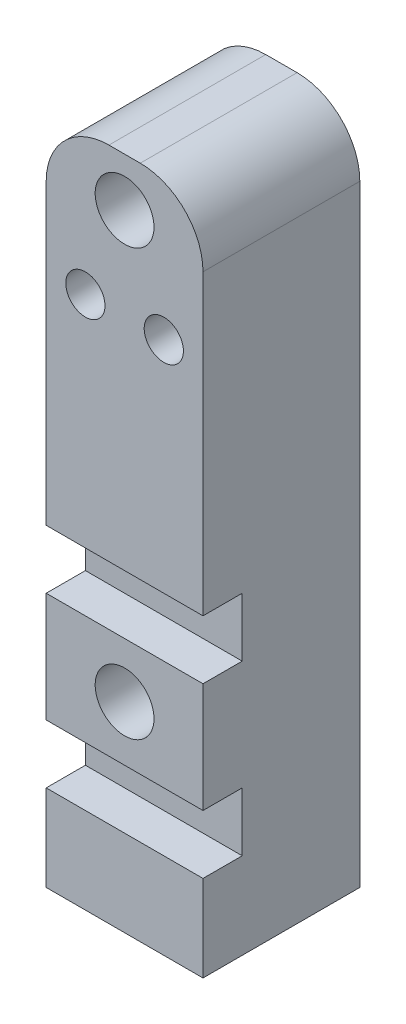
ISO-10303-21;
HEADER;
FILE_DESCRIPTION(('STEP AP214'),'2;1');
FILE_NAME('part.step','',(''),(''),'','','');
FILE_SCHEMA(('AUTOMOTIVE_DESIGN { 1 0 10303 214 1 1 1 1 }'));
ENDSEC;
DATA;
#1=APPLICATION_CONTEXT('core data for automotive mechanical design processes');
#2=APPLICATION_PROTOCOL_DEFINITION('international standard','automotive_design',2000,#1);
#3=PRODUCT_CONTEXT('',#1,'mechanical');
#4=PRODUCT('Part','Part','',(#3));
#5=PRODUCT_RELATED_PRODUCT_CATEGORY('part','',(#4));
#6=PRODUCT_DEFINITION_FORMATION('','',#4);
#7=PRODUCT_DEFINITION_CONTEXT('part definition',#1,'design');
#8=PRODUCT_DEFINITION('design','',#6,#7);
#9=PRODUCT_DEFINITION_SHAPE('','',#8);
#10=(LENGTH_UNIT() NAMED_UNIT(*) SI_UNIT(.MILLI.,.METRE.));
#11=(NAMED_UNIT(*) PLANE_ANGLE_UNIT() SI_UNIT($,.RADIAN.));
#12=(NAMED_UNIT(*) SI_UNIT($,.STERADIAN.) SOLID_ANGLE_UNIT());
#13=UNCERTAINTY_MEASURE_WITH_UNIT(LENGTH_MEASURE(1.E-05),#10,'distance_accuracy_value','');
#14=(GEOMETRIC_REPRESENTATION_CONTEXT(3) GLOBAL_UNCERTAINTY_ASSIGNED_CONTEXT((#13)) GLOBAL_UNIT_ASSIGNED_CONTEXT((#10,
#11,#12)) REPRESENTATION_CONTEXT('',''));
#15=CARTESIAN_POINT('',(0.,0.,0.));
#16=DIRECTION('',(0.,0.,1.));
#17=DIRECTION('',(1.,0.,0.));
#18=AXIS2_PLACEMENT_3D('',#15,#16,#17);
#19=CARTESIAN_POINT('',(-0.5,4.3,0.5));
#20=DIRECTION('',(0.,0.,-1.));
#21=DIRECTION('',(-1.,0.,0.));
#22=AXIS2_PLACEMENT_3D('',#19,#20,#21);
#23=PLANE('',#22);
#24=CARTESIAN_POINT('',(0.,1.275,0.5));
#25=DIRECTION('',(0.,0.,1.));
#26=DIRECTION('',(1.,0.,0.));
#27=AXIS2_PLACEMENT_3D('',#24,#25,#26);
#28=CIRCLE('',#27,0.1875);
#29=CARTESIAN_POINT('',(0.1875,1.275,0.5));
#30=VERTEX_POINT('',#29);
#31=EDGE_CURVE('E293',#30,#30,#28,.T.);
#32=ORIENTED_EDGE('',*,*,#31,.F.);
#33=EDGE_LOOP('',(#32));
#34=FACE_BOUND('',#33,.T.);
#35=DIRECTION('',(0.,-1.,0.));
#36=VECTOR('',#35,1.);
#37=CARTESIAN_POINT('',(0.5,4.3,0.5));
#38=LINE('',#37,#36);
#39=CARTESIAN_POINT('',(0.5,1.625,0.5));
#40=VERTEX_POINT('',#39);
#41=CARTESIAN_POINT('',(0.5,0.925,0.5));
#42=VERTEX_POINT('',#41);
#43=EDGE_CURVE('E218',#40,#42,#38,.T.);
#44=ORIENTED_EDGE('',*,*,#43,.F.);
#45=DIRECTION('',(1.,0.,0.));
#46=VECTOR('',#45,1.);
#47=CARTESIAN_POINT('',(-0.5,1.625,0.5));
#48=LINE('',#47,#46);
#49=CARTESIAN_POINT('',(-0.5,1.625,0.5));
#50=VERTEX_POINT('',#49);
#51=EDGE_CURVE('E152',#50,#40,#48,.T.);
#52=ORIENTED_EDGE('',*,*,#51,.F.);
#53=DIRECTION('',(0.,-1.,0.));
#54=VECTOR('',#53,1.);
#55=CARTESIAN_POINT('',(-0.5,4.3,0.5));
#56=LINE('',#55,#54);
#57=CARTESIAN_POINT('',(-0.5,0.925,0.5));
#58=VERTEX_POINT('',#57);
#59=EDGE_CURVE('E223',#50,#58,#56,.T.);
#60=ORIENTED_EDGE('',*,*,#59,.T.);
#61=DIRECTION('',(1.,0.,0.));
#62=VECTOR('',#61,1.);
#63=CARTESIAN_POINT('',(0.,0.925,0.5));
#64=LINE('',#63,#62);
#65=EDGE_CURVE('E178',#58,#42,#64,.T.);
#66=ORIENTED_EDGE('',*,*,#65,.T.);
#67=EDGE_LOOP('',(#44,#52,#60,#66));
#68=FACE_BOUND('',#67,.T.);
#69=ADVANCED_FACE('F37',(#34,#68),#23,.F.);
#70=CARTESIAN_POINT('',(0.5,4.3,-0.5));
#71=DIRECTION('',(-1.,0.,0.));
#72=DIRECTION('',(0.,0.,1.));
#73=AXIS2_PLACEMENT_3D('',#70,#71,#72);
#74=PLANE('',#73);
#75=DIRECTION('',(0.,1.,0.));
#76=VECTOR('',#75,1.);
#77=CARTESIAN_POINT('',(0.5,2.,0.25));
#78=LINE('',#77,#76);
#79=CARTESIAN_POINT('',(0.5,1.625,0.25));
#80=VERTEX_POINT('',#79);
#81=CARTESIAN_POINT('',(0.5,2.,0.25));
#82=VERTEX_POINT('',#81);
#83=EDGE_CURVE('E143',#80,#82,#78,.T.);
#84=ORIENTED_EDGE('',*,*,#83,.F.);
#85=DIRECTION('',(0.,0.,1.));
#86=VECTOR('',#85,1.);
#87=CARTESIAN_POINT('',(0.5,1.625,0.25));
#88=LINE('',#87,#86);
#89=EDGE_CURVE('E181',#80,#40,#88,.T.);
#90=ORIENTED_EDGE('',*,*,#89,.T.);
#91=ORIENTED_EDGE('',*,*,#43,.T.);
#92=DIRECTION('',(0.,0.,1.));
#93=VECTOR('',#92,1.);
#94=CARTESIAN_POINT('',(0.5,0.925,0.25));
#95=LINE('',#94,#93);
#96=CARTESIAN_POINT('',(0.5,0.925,0.25));
#97=VERTEX_POINT('',#96);
#98=EDGE_CURVE('E183',#97,#42,#95,.T.);
#99=ORIENTED_EDGE('',*,*,#98,.F.);
#100=DIRECTION('',(0.,-1.,0.));
#101=VECTOR('',#100,1.);
#102=CARTESIAN_POINT('',(0.5,0.,0.25));
#103=LINE('',#102,#101);
#104=CARTESIAN_POINT('',(0.5,0.55,0.25));
#105=VERTEX_POINT('',#104);
#106=EDGE_CURVE('E174',#97,#105,#103,.T.);
#107=ORIENTED_EDGE('',*,*,#106,.T.);
#108=DIRECTION('',(0.,0.,1.));
#109=VECTOR('',#108,1.);
#110=CARTESIAN_POINT('',(0.5,0.55,0.25));
#111=LINE('',#110,#109);
#112=CARTESIAN_POINT('',(0.5,0.55,0.5));
#113=VERTEX_POINT('',#112);
#114=EDGE_CURVE('E187',#105,#113,#111,.T.);
#115=ORIENTED_EDGE('',*,*,#114,.T.);
#116=CARTESIAN_POINT('',(0.5,0.,0.5));
#117=VERTEX_POINT('',#116);
#118=EDGE_CURVE('E205',#113,#117,#38,.T.);
#119=ORIENTED_EDGE('',*,*,#118,.T.);
#120=DIRECTION('',(0.,0.,-1.));
#121=VECTOR('',#120,1.);
#122=CARTESIAN_POINT('',(0.5,0.,-0.5));
#123=LINE('',#122,#121);
#124=CARTESIAN_POINT('',(0.5,0.,-0.5));
#125=VERTEX_POINT('',#124);
#126=EDGE_CURVE('E196',#117,#125,#123,.T.);
#127=ORIENTED_EDGE('',*,*,#126,.T.);
#128=DIRECTION('',(0.,-1.,0.));
#129=VECTOR('',#128,1.);
#130=CARTESIAN_POINT('',(0.5,4.3,-0.5));
#131=LINE('',#130,#129);
#132=CARTESIAN_POINT('',(0.5,3.9,-0.5));
#133=VERTEX_POINT('',#132);
#134=EDGE_CURVE('E225',#133,#125,#131,.T.);
#135=ORIENTED_EDGE('',*,*,#134,.F.);
#136=DIRECTION('',(0.,0.,-1.));
#137=VECTOR('',#136,1.);
#138=CARTESIAN_POINT('',(0.5,3.9,0.5));
#139=LINE('',#138,#137);
#140=CARTESIAN_POINT('',(0.5,3.9,0.5));
#141=VERTEX_POINT('',#140);
#142=EDGE_CURVE('E232',#133,#141,#139,.F.);
#143=ORIENTED_EDGE('',*,*,#142,.T.);
#144=CARTESIAN_POINT('',(0.5,2.,0.5));
#145=VERTEX_POINT('',#144);
#146=EDGE_CURVE('E157',#141,#145,#38,.T.);
#147=ORIENTED_EDGE('',*,*,#146,.T.);
#148=DIRECTION('',(0.,0.,1.));
#149=VECTOR('',#148,1.);
#150=CARTESIAN_POINT('',(0.5,2.,0.25));
#151=LINE('',#150,#149);
#152=EDGE_CURVE('E52',#82,#145,#151,.T.);
#153=ORIENTED_EDGE('',*,*,#152,.F.);
#154=EDGE_LOOP('',(#84,#90,#91,#99,#107,#115,#119,#127,#135,#143,#147,#153));
#155=FACE_BOUND('',#154,.T.);
#156=ADVANCED_FACE('F155',(#155),#74,.F.);
#157=CARTESIAN_POINT('',(-0.5,4.3,-0.5));
#158=DIRECTION('',(1.,0.,0.));
#159=DIRECTION('',(0.,0.,-1.));
#160=AXIS2_PLACEMENT_3D('',#157,#158,#159);
#161=PLANE('',#160);
#162=ORIENTED_EDGE('',*,*,#59,.F.);
#163=DIRECTION('',(0.,0.,1.));
#164=VECTOR('',#163,1.);
#165=CARTESIAN_POINT('',(-0.5,1.625,0.25));
#166=LINE('',#165,#164);
#167=CARTESIAN_POINT('',(-0.5,1.625,0.25));
#168=VERTEX_POINT('',#167);
#169=EDGE_CURVE('E159',#168,#50,#166,.T.);
#170=ORIENTED_EDGE('',*,*,#169,.F.);
#171=DIRECTION('',(0.,-1.,0.));
#172=VECTOR('',#171,1.);
#173=CARTESIAN_POINT('',(-0.5,1.625,0.25));
#174=LINE('',#173,#172);
#175=CARTESIAN_POINT('',(-0.5,2.,0.25));
#176=VERTEX_POINT('',#175);
#177=EDGE_CURVE('E142',#176,#168,#174,.T.);
#178=ORIENTED_EDGE('',*,*,#177,.F.);
#179=DIRECTION('',(0.,0.,1.));
#180=VECTOR('',#179,1.);
#181=CARTESIAN_POINT('',(-0.5,2.,0.25));
#182=LINE('',#181,#180);
#183=CARTESIAN_POINT('',(-0.5,2.,0.5));
#184=VERTEX_POINT('',#183);
#185=EDGE_CURVE('E139',#176,#184,#182,.T.);
#186=ORIENTED_EDGE('',*,*,#185,.T.);
#187=CARTESIAN_POINT('',(-0.5,3.9,0.5));
#188=VERTEX_POINT('',#187);
#189=EDGE_CURVE('E219',#188,#184,#56,.T.);
#190=ORIENTED_EDGE('',*,*,#189,.F.);
#191=DIRECTION('',(0.,0.,1.));
#192=VECTOR('',#191,1.);
#193=CARTESIAN_POINT('',(-0.5,3.9,-0.5));
#194=LINE('',#193,#192);
#195=CARTESIAN_POINT('',(-0.5,3.9,-0.5));
#196=VERTEX_POINT('',#195);
#197=EDGE_CURVE('E45',#188,#196,#194,.F.);
#198=ORIENTED_EDGE('',*,*,#197,.T.);
#199=DIRECTION('',(0.,-1.,0.));
#200=VECTOR('',#199,1.);
#201=CARTESIAN_POINT('',(-0.5,4.3,-0.5));
#202=LINE('',#201,#200);
#203=CARTESIAN_POINT('',(-0.5,0.,-0.5));
#204=VERTEX_POINT('',#203);
#205=EDGE_CURVE('E222',#196,#204,#202,.T.);
#206=ORIENTED_EDGE('',*,*,#205,.T.);
#207=DIRECTION('',(0.,0.,1.));
#208=VECTOR('',#207,1.);
#209=CARTESIAN_POINT('',(-0.5,0.,-0.5));
#210=LINE('',#209,#208);
#211=CARTESIAN_POINT('',(-0.5,0.,0.5));
#212=VERTEX_POINT('',#211);
#213=EDGE_CURVE('E211',#204,#212,#210,.T.);
#214=ORIENTED_EDGE('',*,*,#213,.T.);
#215=CARTESIAN_POINT('',(-0.5,0.550000000000001,0.5));
#216=VERTEX_POINT('',#215);
#217=EDGE_CURVE('E217',#216,#212,#56,.T.);
#218=ORIENTED_EDGE('',*,*,#217,.F.);
#219=DIRECTION('',(0.,0.,1.));
#220=VECTOR('',#219,1.);
#221=CARTESIAN_POINT('',(-0.5,0.55,0.25));
#222=LINE('',#221,#220);
#223=CARTESIAN_POINT('',(-0.5,0.55,0.25));
#224=VERTEX_POINT('',#223);
#225=EDGE_CURVE('E60',#224,#216,#222,.T.);
#226=ORIENTED_EDGE('',*,*,#225,.F.);
#227=DIRECTION('',(0.,-1.,0.));
#228=VECTOR('',#227,1.);
#229=CARTESIAN_POINT('',(-0.5,0.,0.25));
#230=LINE('',#229,#228);
#231=CARTESIAN_POINT('',(-0.5,0.925,0.25));
#232=VERTEX_POINT('',#231);
#233=EDGE_CURVE('E167',#232,#224,#230,.T.);
#234=ORIENTED_EDGE('',*,*,#233,.F.);
#235=DIRECTION('',(0.,0.,1.));
#236=VECTOR('',#235,1.);
#237=CARTESIAN_POINT('',(-0.5,0.925,0.25));
#238=LINE('',#237,#236);
#239=EDGE_CURVE('E177',#232,#58,#238,.T.);
#240=ORIENTED_EDGE('',*,*,#239,.T.);
#241=EDGE_LOOP('',(#162,#170,#178,#186,#190,#198,#206,#214,#218,#226,#234,#240));
#242=FACE_BOUND('',#241,.T.);
#243=ADVANCED_FACE('F246',(#242),#161,.F.);
#244=CARTESIAN_POINT('',(0.25,3.4,0.5));
#245=DIRECTION('',(0.,0.,1.));
#246=DIRECTION('',(1.,0.,0.));
#247=AXIS2_PLACEMENT_3D('',#244,#245,#246);
#248=CIRCLE('',#247,0.125);
#249=CARTESIAN_POINT('',(0.375,3.4,0.5));
#250=VERTEX_POINT('',#249);
#251=EDGE_CURVE('E311',#250,#250,#248,.T.);
#252=ORIENTED_EDGE('',*,*,#251,.F.);
#253=EDGE_LOOP('',(#252));
#254=FACE_BOUND('',#253,.T.);
#255=CARTESIAN_POINT('',(-0.25,3.4,0.5));
#256=DIRECTION('',(0.,0.,1.));
#257=DIRECTION('',(1.,0.,0.));
#258=AXIS2_PLACEMENT_3D('',#255,#256,#257);
#259=CIRCLE('',#258,0.125);
#260=CARTESIAN_POINT('',(-0.125,3.4,0.5));
#261=VERTEX_POINT('',#260);
#262=EDGE_CURVE('E305',#261,#261,#259,.T.);
#263=ORIENTED_EDGE('',*,*,#262,.F.);
#264=EDGE_LOOP('',(#263));
#265=FACE_BOUND('',#264,.T.);
#266=CARTESIAN_POINT('',(0.,3.99,0.5));
#267=DIRECTION('',(0.,0.,1.));
#268=DIRECTION('',(1.,0.,0.));
#269=AXIS2_PLACEMENT_3D('',#266,#267,#268);
#270=CIRCLE('',#269,0.1875);
#271=CARTESIAN_POINT('',(0.1875,3.99,0.5));
#272=VERTEX_POINT('',#271);
#273=EDGE_CURVE('E299',#272,#272,#270,.T.);
#274=ORIENTED_EDGE('',*,*,#273,.F.);
#275=EDGE_LOOP('',(#274));
#276=FACE_BOUND('',#275,.T.);
#277=ORIENTED_EDGE('',*,*,#189,.T.);
#278=DIRECTION('',(-1.,0.,0.));
#279=VECTOR('',#278,1.);
#280=CARTESIAN_POINT('',(-0.5,2.,0.5));
#281=LINE('',#280,#279);
#282=EDGE_CURVE('E289',#145,#184,#281,.T.);
#283=ORIENTED_EDGE('',*,*,#282,.F.);
#284=ORIENTED_EDGE('',*,*,#146,.F.);
#285=CARTESIAN_POINT('',(0.1,3.9,0.5));
#286=DIRECTION('',(0.,0.,-1.));
#287=DIRECTION('',(-1.,0.,0.));
#288=AXIS2_PLACEMENT_3D('',#285,#286,#287);
#289=CIRCLE('',#288,0.4);
#290=CARTESIAN_POINT('',(0.1,4.3,0.5));
#291=VERTEX_POINT('',#290);
#292=EDGE_CURVE('E234',#141,#291,#289,.F.);
#293=ORIENTED_EDGE('',*,*,#292,.T.);
#294=DIRECTION('',(1.,0.,0.));
#295=VECTOR('',#294,1.);
#296=CARTESIAN_POINT('',(-0.5,4.3,0.5));
#297=LINE('',#296,#295);
#298=CARTESIAN_POINT('',(-0.0999999999999999,4.3,0.5));
#299=VERTEX_POINT('',#298);
#300=EDGE_CURVE('E202',#299,#291,#297,.T.);
#301=ORIENTED_EDGE('',*,*,#300,.F.);
#302=CARTESIAN_POINT('',(-0.0999999999999999,3.9,0.5));
#303=DIRECTION('',(0.,0.,-1.));
#304=DIRECTION('',(-1.,0.,0.));
#305=AXIS2_PLACEMENT_3D('',#302,#303,#304);
#306=CIRCLE('',#305,0.4);
#307=EDGE_CURVE('E240',#299,#188,#306,.F.);
#308=ORIENTED_EDGE('',*,*,#307,.T.);
#309=EDGE_LOOP('',(#277,#283,#284,#293,#301,#308));
#310=FACE_BOUND('',#309,.T.);
#311=ADVANCED_FACE('F259',(#254,#265,#276,#310),#23,.F.);
#312=CARTESIAN_POINT('',(-0.5,4.3,-0.5));
#313=DIRECTION('',(0.,0.,1.));
#314=DIRECTION('',(1.,0.,0.));
#315=AXIS2_PLACEMENT_3D('',#312,#313,#314);
#316=PLANE('',#315);
#317=CARTESIAN_POINT('',(0.25,3.4,-0.5));
#318=DIRECTION('',(0.,0.,1.));
#319=DIRECTION('',(1.,0.,0.));
#320=AXIS2_PLACEMENT_3D('',#317,#318,#319);
#321=CIRCLE('',#320,0.125);
#322=CARTESIAN_POINT('',(0.375,3.4,-0.5));
#323=VERTEX_POINT('',#322);
#324=EDGE_CURVE('E302',#323,#323,#321,.T.);
#325=ORIENTED_EDGE('',*,*,#324,.T.);
#326=EDGE_LOOP('',(#325));
#327=FACE_BOUND('',#326,.T.);
#328=CARTESIAN_POINT('',(-0.25,3.4,-0.5));
#329=DIRECTION('',(0.,0.,1.));
#330=DIRECTION('',(1.,0.,0.));
#331=AXIS2_PLACEMENT_3D('',#328,#329,#330);
#332=CIRCLE('',#331,0.125);
#333=CARTESIAN_POINT('',(-0.125,3.4,-0.5));
#334=VERTEX_POINT('',#333);
#335=EDGE_CURVE('E308',#334,#334,#332,.T.);
#336=ORIENTED_EDGE('',*,*,#335,.T.);
#337=EDGE_LOOP('',(#336));
#338=FACE_BOUND('',#337,.T.);
#339=CARTESIAN_POINT('',(0.,1.275,-0.5));
#340=DIRECTION('',(0.,0.,1.));
#341=DIRECTION('',(1.,0.,0.));
#342=AXIS2_PLACEMENT_3D('',#339,#340,#341);
#343=CIRCLE('',#342,0.1875);
#344=CARTESIAN_POINT('',(0.1875,1.275,-0.5));
#345=VERTEX_POINT('',#344);
#346=EDGE_CURVE('E290',#345,#345,#343,.T.);
#347=ORIENTED_EDGE('',*,*,#346,.T.);
#348=EDGE_LOOP('',(#347));
#349=FACE_BOUND('',#348,.T.);
#350=ORIENTED_EDGE('',*,*,#205,.F.);
#351=CARTESIAN_POINT('',(-0.1,3.9,-0.5));
#352=DIRECTION('',(0.,0.,1.));
#353=DIRECTION('',(1.,0.,0.));
#354=AXIS2_PLACEMENT_3D('',#351,#352,#353);
#355=CIRCLE('',#354,0.4);
#356=CARTESIAN_POINT('',(-0.1,4.3,-0.5));
#357=VERTEX_POINT('',#356);
#358=EDGE_CURVE('E11',#196,#357,#355,.F.);
#359=ORIENTED_EDGE('',*,*,#358,.T.);
#360=DIRECTION('',(-1.,0.,0.));
#361=VECTOR('',#360,1.);
#362=CARTESIAN_POINT('',(-0.5,4.3,-0.5));
#363=LINE('',#362,#361);
#364=CARTESIAN_POINT('',(0.0999999999999999,4.3,-0.5));
#365=VERTEX_POINT('',#364);
#366=EDGE_CURVE('E199',#365,#357,#363,.T.);
#367=ORIENTED_EDGE('',*,*,#366,.F.);
#368=CARTESIAN_POINT('',(0.0999999999999999,3.9,-0.5));
#369=DIRECTION('',(0.,0.,1.));
#370=DIRECTION('',(1.,0.,0.));
#371=AXIS2_PLACEMENT_3D('',#368,#369,#370);
#372=CIRCLE('',#371,0.4);
#373=EDGE_CURVE('E230',#365,#133,#372,.F.);
#374=ORIENTED_EDGE('',*,*,#373,.T.);
#375=ORIENTED_EDGE('',*,*,#134,.T.);
#376=DIRECTION('',(-1.,0.,0.));
#377=VECTOR('',#376,1.);
#378=CARTESIAN_POINT('',(-0.5,0.,-0.5));
#379=LINE('',#378,#377);
#380=EDGE_CURVE('E208',#125,#204,#379,.T.);
#381=ORIENTED_EDGE('',*,*,#380,.T.);
#382=EDGE_LOOP('',(#350,#359,#367,#374,#375,#381));
#383=FACE_BOUND('',#382,.T.);
#384=ADVANCED_FACE('F250',(#327,#338,#349,#383),#316,.F.);
#385=ORIENTED_EDGE('',*,*,#118,.F.);
#386=DIRECTION('',(1.,0.,0.));
#387=VECTOR('',#386,1.);
#388=CARTESIAN_POINT('',(0.,0.55,0.5));
#389=LINE('',#388,#387);
#390=EDGE_CURVE('E168',#216,#113,#389,.T.);
#391=ORIENTED_EDGE('',*,*,#390,.F.);
#392=ORIENTED_EDGE('',*,*,#217,.T.);
#393=DIRECTION('',(1.,0.,0.));
#394=VECTOR('',#393,1.);
#395=CARTESIAN_POINT('',(-0.5,0.,0.5));
#396=LINE('',#395,#394);
#397=EDGE_CURVE('E203',#212,#117,#396,.T.);
#398=ORIENTED_EDGE('',*,*,#397,.T.);
#399=EDGE_LOOP('',(#385,#391,#392,#398));
#400=FACE_BOUND('',#399,.T.);
#401=ADVANCED_FACE('F329',(#400),#23,.F.);
#402=CARTESIAN_POINT('',(0.,4.3,0.));
#403=DIRECTION('',(0.,1.,0.));
#404=DIRECTION('',(0.,0.,1.));
#405=AXIS2_PLACEMENT_3D('',#402,#403,#404);
#406=PLANE('',#405);
#407=ORIENTED_EDGE('',*,*,#366,.T.);
#408=DIRECTION('',(0.,0.,1.));
#409=VECTOR('',#408,1.);
#410=CARTESIAN_POINT('',(-0.0999999999999999,4.3,0.5));
#411=LINE('',#410,#409);
#412=EDGE_CURVE('E237',#357,#299,#411,.T.);
#413=ORIENTED_EDGE('',*,*,#412,.T.);
#414=ORIENTED_EDGE('',*,*,#300,.T.);
#415=DIRECTION('',(0.,0.,-1.));
#416=VECTOR('',#415,1.);
#417=CARTESIAN_POINT('',(0.0999999999999999,4.3,-0.5));
#418=LINE('',#417,#416);
#419=EDGE_CURVE('E227',#291,#365,#418,.T.);
#420=ORIENTED_EDGE('',*,*,#419,.T.);
#421=EDGE_LOOP('',(#407,#413,#414,#420));
#422=FACE_BOUND('',#421,.T.);
#423=ADVANCED_FACE('F257',(#422),#406,.T.);
#424=CARTESIAN_POINT('',(0.,0.,0.));
#425=DIRECTION('',(0.,1.,0.));
#426=DIRECTION('',(0.,0.,1.));
#427=AXIS2_PLACEMENT_3D('',#424,#425,#426);
#428=PLANE('',#427);
#429=CARTESIAN_POINT('',(0.,0.,0.));
#430=DIRECTION('',(0.,1.,0.));
#431=DIRECTION('',(0.,0.,1.));
#432=AXIS2_PLACEMENT_3D('',#429,#430,#431);
#433=CIRCLE('',#432,0.1);
#434=CARTESIAN_POINT('',(0.,0.,0.1));
#435=VERTEX_POINT('',#434);
#436=EDGE_CURVE('E186',#435,#435,#433,.T.);
#437=ORIENTED_EDGE('',*,*,#436,.T.);
#438=EDGE_LOOP('',(#437));
#439=FACE_BOUND('',#438,.T.);
#440=ORIENTED_EDGE('',*,*,#126,.F.);
#441=ORIENTED_EDGE('',*,*,#397,.F.);
#442=ORIENTED_EDGE('',*,*,#213,.F.);
#443=ORIENTED_EDGE('',*,*,#380,.F.);
#444=EDGE_LOOP('',(#440,#441,#442,#443));
#445=FACE_BOUND('',#444,.T.);
#446=ADVANCED_FACE('F270',(#439,#445),#428,.F.);
#447=CARTESIAN_POINT('',(0.1,3.9,0.));
#448=DIRECTION('',(0.,0.,1.));
#449=DIRECTION('',(1.,0.,0.));
#450=AXIS2_PLACEMENT_3D('',#447,#448,#449);
#451=CYLINDRICAL_SURFACE('',#450,0.4);
#452=ORIENTED_EDGE('',*,*,#292,.F.);
#453=ORIENTED_EDGE('',*,*,#142,.F.);
#454=ORIENTED_EDGE('',*,*,#373,.F.);
#455=ORIENTED_EDGE('',*,*,#419,.F.);
#456=EDGE_LOOP('',(#452,#453,#454,#455));
#457=FACE_BOUND('',#456,.T.);
#458=ADVANCED_FACE('F264',(#457),#451,.T.);
#459=CARTESIAN_POINT('',(-0.1,3.9,0.));
#460=DIRECTION('',(0.,0.,-1.));
#461=DIRECTION('',(-1.,0.,0.));
#462=AXIS2_PLACEMENT_3D('',#459,#460,#461);
#463=CYLINDRICAL_SURFACE('',#462,0.4);
#464=ORIENTED_EDGE('',*,*,#358,.F.);
#465=ORIENTED_EDGE('',*,*,#197,.F.);
#466=ORIENTED_EDGE('',*,*,#307,.F.);
#467=ORIENTED_EDGE('',*,*,#412,.F.);
#468=EDGE_LOOP('',(#464,#465,#466,#467));
#469=FACE_BOUND('',#468,.T.);
#470=ADVANCED_FACE('F39',(#469),#463,.T.);
#471=CARTESIAN_POINT('',(0.,0.7,0.));
#472=DIRECTION('',(0.,-1.,0.));
#473=DIRECTION('',(0.,0.,-1.));
#474=AXIS2_PLACEMENT_3D('',#471,#472,#473);
#475=CYLINDRICAL_SURFACE('',#474,0.1);
#476=CARTESIAN_POINT('',(0.,0.7,0.));
#477=DIRECTION('',(0.,1.,0.));
#478=DIRECTION('',(0.,0.,1.));
#479=AXIS2_PLACEMENT_3D('',#476,#477,#478);
#480=CIRCLE('',#479,0.1);
#481=CARTESIAN_POINT('',(0.,0.7,0.1));
#482=VERTEX_POINT('',#481);
#483=EDGE_CURVE('E193',#482,#482,#480,.T.);
#484=ORIENTED_EDGE('',*,*,#483,.T.);
#485=EDGE_LOOP('',(#484));
#486=FACE_BOUND('',#485,.T.);
#487=ORIENTED_EDGE('',*,*,#436,.F.);
#488=EDGE_LOOP('',(#487));
#489=FACE_BOUND('',#488,.T.);
#490=ADVANCED_FACE('F380',(#486,#489),#475,.F.);
#491=CARTESIAN_POINT('',(0.,0.7,0.));
#492=DIRECTION('',(0.,1.,0.));
#493=DIRECTION('',(0.,0.,1.));
#494=AXIS2_PLACEMENT_3D('',#491,#492,#493);
#495=PLANE('',#494);
#496=ORIENTED_EDGE('',*,*,#483,.F.);
#497=EDGE_LOOP('',(#496));
#498=FACE_BOUND('',#497,.T.);
#499=ADVANCED_FACE('F374',(#498),#495,.F.);
#500=CARTESIAN_POINT('',(0.,0.925,0.25));
#501=DIRECTION('',(0.,-1.,0.));
#502=DIRECTION('',(0.,0.,-1.));
#503=AXIS2_PLACEMENT_3D('',#500,#501,#502);
#504=PLANE('',#503);
#505=ORIENTED_EDGE('',*,*,#65,.F.);
#506=ORIENTED_EDGE('',*,*,#239,.F.);
#507=DIRECTION('',(1.,0.,0.));
#508=VECTOR('',#507,1.);
#509=CARTESIAN_POINT('',(0.,0.925,0.25));
#510=LINE('',#509,#508);
#511=EDGE_CURVE('E164',#232,#97,#510,.T.);
#512=ORIENTED_EDGE('',*,*,#511,.T.);
#513=ORIENTED_EDGE('',*,*,#98,.T.);
#514=EDGE_LOOP('',(#505,#506,#512,#513));
#515=FACE_BOUND('',#514,.T.);
#516=ADVANCED_FACE('F280',(#515),#504,.T.);
#517=CARTESIAN_POINT('',(0.,0.55,0.25));
#518=DIRECTION('',(0.,-1.,0.));
#519=DIRECTION('',(1.,0.,0.));
#520=AXIS2_PLACEMENT_3D('',#517,#518,#519);
#521=PLANE('',#520);
#522=ORIENTED_EDGE('',*,*,#390,.T.);
#523=ORIENTED_EDGE('',*,*,#114,.F.);
#524=DIRECTION('',(1.,0.,0.));
#525=VECTOR('',#524,1.);
#526=CARTESIAN_POINT('',(0.,0.55,0.25));
#527=LINE('',#526,#525);
#528=EDGE_CURVE('E171',#224,#105,#527,.T.);
#529=ORIENTED_EDGE('',*,*,#528,.F.);
#530=ORIENTED_EDGE('',*,*,#225,.T.);
#531=EDGE_LOOP('',(#522,#523,#529,#530));
#532=FACE_BOUND('',#531,.T.);
#533=ADVANCED_FACE('F365',(#532),#521,.F.);
#534=CARTESIAN_POINT('',(0.,0.,0.25));
#535=DIRECTION('',(0.,0.,1.));
#536=DIRECTION('',(1.,0.,0.));
#537=AXIS2_PLACEMENT_3D('',#534,#535,#536);
#538=PLANE('',#537);
#539=ORIENTED_EDGE('',*,*,#511,.F.);
#540=ORIENTED_EDGE('',*,*,#233,.T.);
#541=ORIENTED_EDGE('',*,*,#528,.T.);
#542=ORIENTED_EDGE('',*,*,#106,.F.);
#543=EDGE_LOOP('',(#539,#540,#541,#542));
#544=FACE_BOUND('',#543,.T.);
#545=ADVANCED_FACE('F284',(#544),#538,.T.);
#546=CARTESIAN_POINT('',(-0.5,1.625,0.25));
#547=DIRECTION('',(0.,-1.,0.));
#548=DIRECTION('',(1.,0.,0.));
#549=AXIS2_PLACEMENT_3D('',#546,#547,#548);
#550=PLANE('',#549);
#551=ORIENTED_EDGE('',*,*,#51,.T.);
#552=ORIENTED_EDGE('',*,*,#89,.F.);
#553=DIRECTION('',(1.,0.,0.));
#554=VECTOR('',#553,1.);
#555=CARTESIAN_POINT('',(-0.5,1.625,0.25));
#556=LINE('',#555,#554);
#557=EDGE_CURVE('E149',#168,#80,#556,.T.);
#558=ORIENTED_EDGE('',*,*,#557,.F.);
#559=ORIENTED_EDGE('',*,*,#169,.T.);
#560=EDGE_LOOP('',(#551,#552,#558,#559));
#561=FACE_BOUND('',#560,.T.);
#562=ADVANCED_FACE('F372',(#561),#550,.F.);
#563=CARTESIAN_POINT('',(-0.5,2.,0.25));
#564=DIRECTION('',(0.,1.,0.));
#565=DIRECTION('',(0.,0.,1.));
#566=AXIS2_PLACEMENT_3D('',#563,#564,#565);
#567=PLANE('',#566);
#568=ORIENTED_EDGE('',*,*,#282,.T.);
#569=ORIENTED_EDGE('',*,*,#185,.F.);
#570=DIRECTION('',(-1.,0.,0.));
#571=VECTOR('',#570,1.);
#572=CARTESIAN_POINT('',(-0.5,2.,0.25));
#573=LINE('',#572,#571);
#574=EDGE_CURVE('E135',#82,#176,#573,.T.);
#575=ORIENTED_EDGE('',*,*,#574,.F.);
#576=ORIENTED_EDGE('',*,*,#152,.T.);
#577=EDGE_LOOP('',(#568,#569,#575,#576));
#578=FACE_BOUND('',#577,.T.);
#579=ADVANCED_FACE('F137',(#578),#567,.F.);
#580=CARTESIAN_POINT('',(0.,0.,0.25));
#581=DIRECTION('',(0.,0.,1.));
#582=DIRECTION('',(1.,0.,0.));
#583=AXIS2_PLACEMENT_3D('',#580,#581,#582);
#584=PLANE('',#583);
#585=ORIENTED_EDGE('',*,*,#83,.T.);
#586=ORIENTED_EDGE('',*,*,#574,.T.);
#587=ORIENTED_EDGE('',*,*,#177,.T.);
#588=ORIENTED_EDGE('',*,*,#557,.T.);
#589=EDGE_LOOP('',(#585,#586,#587,#588));
#590=FACE_BOUND('',#589,.T.);
#591=ADVANCED_FACE('F147',(#590),#584,.T.);
#592=CARTESIAN_POINT('',(0.,1.275,-0.5));
#593=DIRECTION('',(0.,0.,1.));
#594=DIRECTION('',(1.,0.,0.));
#595=AXIS2_PLACEMENT_3D('',#592,#593,#594);
#596=CYLINDRICAL_SURFACE('',#595,0.1875);
#597=ORIENTED_EDGE('',*,*,#346,.F.);
#598=EDGE_LOOP('',(#597));
#599=FACE_BOUND('',#598,.T.);
#600=ORIENTED_EDGE('',*,*,#31,.T.);
#601=EDGE_LOOP('',(#600));
#602=FACE_BOUND('',#601,.T.);
#603=ADVANCED_FACE('F337',(#599,#602),#596,.F.);
#604=CARTESIAN_POINT('',(0.,3.99,-0.15));
#605=DIRECTION('',(0.,0.,1.));
#606=DIRECTION('',(1.,0.,0.));
#607=AXIS2_PLACEMENT_3D('',#604,#605,#606);
#608=CYLINDRICAL_SURFACE('',#607,0.1875);
#609=CARTESIAN_POINT('',(0.,3.99,-0.15));
#610=DIRECTION('',(0.,0.,1.));
#611=DIRECTION('',(1.,0.,0.));
#612=AXIS2_PLACEMENT_3D('',#609,#610,#611);
#613=CIRCLE('',#612,0.1875);
#614=CARTESIAN_POINT('',(0.1875,3.99,-0.15));
#615=VERTEX_POINT('',#614);
#616=EDGE_CURVE('E296',#615,#615,#613,.T.);
#617=ORIENTED_EDGE('',*,*,#616,.F.);
#618=EDGE_LOOP('',(#617));
#619=FACE_BOUND('',#618,.T.);
#620=ORIENTED_EDGE('',*,*,#273,.T.);
#621=EDGE_LOOP('',(#620));
#622=FACE_BOUND('',#621,.T.);
#623=ADVANCED_FACE('F334',(#619,#622),#608,.F.);
#624=CARTESIAN_POINT('',(0.,3.99,-0.15));
#625=DIRECTION('',(0.,0.,1.));
#626=DIRECTION('',(1.,0.,0.));
#627=AXIS2_PLACEMENT_3D('',#624,#625,#626);
#628=PLANE('',#627);
#629=ORIENTED_EDGE('',*,*,#616,.T.);
#630=EDGE_LOOP('',(#629));
#631=FACE_BOUND('',#630,.T.);
#632=ADVANCED_FACE('F336',(#631),#628,.T.);
#633=CARTESIAN_POINT('',(-0.25,3.4,-0.5));
#634=DIRECTION('',(0.,0.,1.));
#635=DIRECTION('',(1.,0.,0.));
#636=AXIS2_PLACEMENT_3D('',#633,#634,#635);
#637=CYLINDRICAL_SURFACE('',#636,0.125);
#638=ORIENTED_EDGE('',*,*,#335,.F.);
#639=EDGE_LOOP('',(#638));
#640=FACE_BOUND('',#639,.T.);
#641=ORIENTED_EDGE('',*,*,#262,.T.);
#642=EDGE_LOOP('',(#641));
#643=FACE_BOUND('',#642,.T.);
#644=ADVANCED_FACE('F322',(#640,#643),#637,.F.);
#645=CARTESIAN_POINT('',(0.25,3.4,-0.5));
#646=DIRECTION('',(0.,0.,1.));
#647=DIRECTION('',(1.,0.,0.));
#648=AXIS2_PLACEMENT_3D('',#645,#646,#647);
#649=CYLINDRICAL_SURFACE('',#648,0.125);
#650=ORIENTED_EDGE('',*,*,#324,.F.);
#651=EDGE_LOOP('',(#650));
#652=FACE_BOUND('',#651,.T.);
#653=ORIENTED_EDGE('',*,*,#251,.T.);
#654=EDGE_LOOP('',(#653));
#655=FACE_BOUND('',#654,.T.);
#656=ADVANCED_FACE('F319',(#652,#655),#649,.F.);
#657=CLOSED_SHELL('',(#69,#156,#243,#311,#384,#401,#423,#446,#458,#470,#490,#499,#516,#533,#545,
#562,#579,#591,#603,#623,#632,#644,#656));
#658=MANIFOLD_SOLID_BREP('B2',#657);
#659=ADVANCED_BREP_SHAPE_REPRESENTATION('',(#18,#658),#14);
#660=SHAPE_DEFINITION_REPRESENTATION(#9,#659);
ENDSEC;
END-ISO-10303-21;
